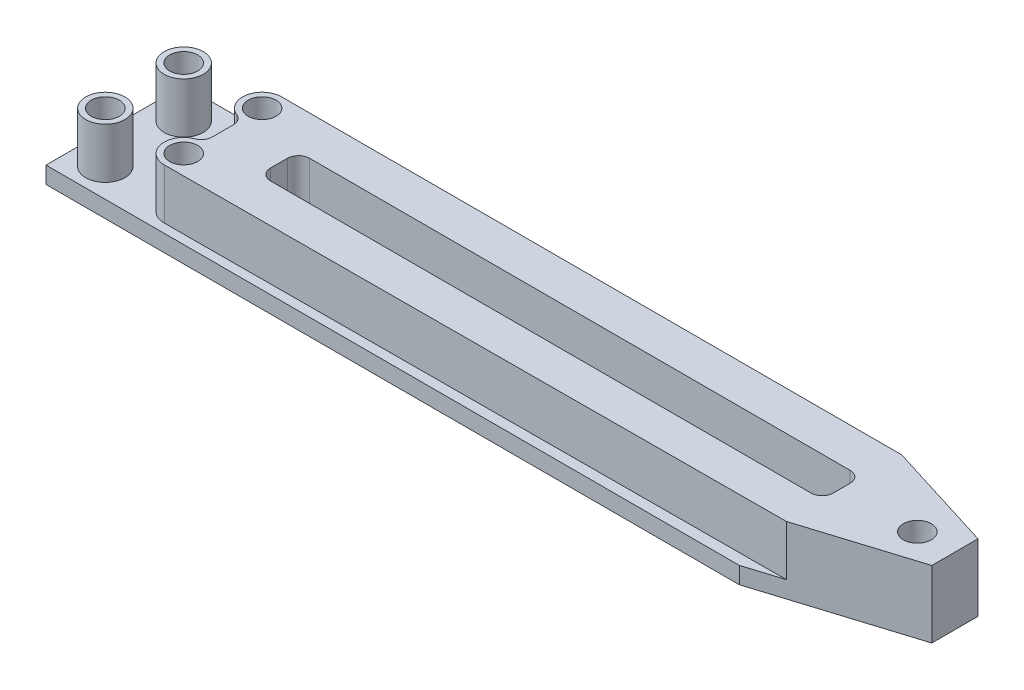
ISO-10303-21;
HEADER;
FILE_DESCRIPTION(('STEP AP214'),'2;1');
FILE_NAME('part.step','',(''),(''),'','','');
FILE_SCHEMA(('AUTOMOTIVE_DESIGN { 1 0 10303 214 1 1 1 1 }'));
ENDSEC;
DATA;
#1=APPLICATION_CONTEXT('core data for automotive mechanical design processes');
#2=APPLICATION_PROTOCOL_DEFINITION('international standard','automotive_design',2000,#1);
#3=PRODUCT_CONTEXT('',#1,'mechanical');
#4=PRODUCT('Part','Part','',(#3));
#5=PRODUCT_RELATED_PRODUCT_CATEGORY('part','',(#4));
#6=PRODUCT_DEFINITION_FORMATION('','',#4);
#7=PRODUCT_DEFINITION_CONTEXT('part definition',#1,'design');
#8=PRODUCT_DEFINITION('design','',#6,#7);
#9=PRODUCT_DEFINITION_SHAPE('','',#8);
#10=(LENGTH_UNIT() NAMED_UNIT(*) SI_UNIT(.MILLI.,.METRE.));
#11=(NAMED_UNIT(*) PLANE_ANGLE_UNIT() SI_UNIT($,.RADIAN.));
#12=(NAMED_UNIT(*) SI_UNIT($,.STERADIAN.) SOLID_ANGLE_UNIT());
#13=UNCERTAINTY_MEASURE_WITH_UNIT(LENGTH_MEASURE(1.E-05),#10,'distance_accuracy_value','');
#14=(GEOMETRIC_REPRESENTATION_CONTEXT(3) GLOBAL_UNCERTAINTY_ASSIGNED_CONTEXT((#13)) GLOBAL_UNIT_ASSIGNED_CONTEXT((#10,
#11,#12)) REPRESENTATION_CONTEXT('',''));
#15=CARTESIAN_POINT('',(0.,0.,0.));
#16=DIRECTION('',(0.,0.,1.));
#17=DIRECTION('',(1.,0.,0.));
#18=AXIS2_PLACEMENT_3D('',#15,#16,#17);
#19=CARTESIAN_POINT('',(0.,3.,0.));
#20=DIRECTION('',(0.,1.,0.));
#21=DIRECTION('',(0.,0.,1.));
#22=AXIS2_PLACEMENT_3D('',#19,#20,#21);
#23=PLANE('',#22);
#24=CARTESIAN_POINT('',(5.50000000000015,3.,-5.51588226593636));
#25=DIRECTION('',(0.,1.,0.));
#26=DIRECTION('',(0.,0.,1.));
#27=AXIS2_PLACEMENT_3D('',#24,#25,#26);
#28=CIRCLE('',#27,3.5);
#29=CARTESIAN_POINT('',(5.50000000000015,3.,-2.01588226593636));
#30=VERTEX_POINT('',#29);
#31=EDGE_CURVE('E221',#30,#30,#28,.T.);
#32=ORIENTED_EDGE('',*,*,#31,.F.);
#33=EDGE_LOOP('',(#32));
#34=FACE_BOUND('',#33,.T.);
#35=CARTESIAN_POINT('',(5.5,3.,-19.5158822659364));
#36=DIRECTION('',(0.,1.,0.));
#37=DIRECTION('',(0.,0.,1.));
#38=AXIS2_PLACEMENT_3D('',#35,#36,#37);
#39=CIRCLE('',#38,3.5);
#40=CARTESIAN_POINT('',(5.5,3.,-16.0158822659364));
#41=VERTEX_POINT('',#40);
#42=EDGE_CURVE('E247',#41,#41,#39,.T.);
#43=ORIENTED_EDGE('',*,*,#42,.F.);
#44=EDGE_LOOP('',(#43));
#45=FACE_BOUND('',#44,.T.);
#46=CARTESIAN_POINT('',(19.5000000000001,3.,-5.51588226593636));
#47=DIRECTION('',(0.,1.,0.));
#48=DIRECTION('',(0.,0.,1.));
#49=AXIS2_PLACEMENT_3D('',#46,#47,#48);
#50=CIRCLE('',#49,3.5);
#51=CARTESIAN_POINT('',(18.2272727272728,3.,-8.77627569146892));
#52=VERTEX_POINT('',#51);
#53=CARTESIAN_POINT('',(19.5259168115753,3.,-2.01597822169775));
#54=VERTEX_POINT('',#53);
#55=EDGE_CURVE('E203',#52,#54,#50,.T.);
#56=ORIENTED_EDGE('',*,*,#55,.F.);
#57=CARTESIAN_POINT('',(17.5,3.,-10.6393576489161));
#58=DIRECTION('',(0.,1.,0.));
#59=DIRECTION('',(0.,0.,1.));
#60=AXIS2_PLACEMENT_3D('',#57,#58,#59);
#61=CIRCLE('',#60,2.);
#62=CARTESIAN_POINT('',(19.5,3.,-10.6393576489161));
#63=VERTEX_POINT('',#62);
#64=EDGE_CURVE('E300',#52,#63,#61,.T.);
#65=ORIENTED_EDGE('',*,*,#64,.T.);
#66=DIRECTION('',(0.,0.,1.));
#67=VECTOR('',#66,1.);
#68=CARTESIAN_POINT('',(19.5,3.,0.));
#69=LINE('',#68,#67);
#70=CARTESIAN_POINT('',(19.5,3.,-14.3924068829566));
#71=VERTEX_POINT('',#70);
#72=EDGE_CURVE('E379',#71,#63,#69,.T.);
#73=ORIENTED_EDGE('',*,*,#72,.F.);
#74=CARTESIAN_POINT('',(17.5,3.,-14.3924068829566));
#75=DIRECTION('',(0.,1.,0.));
#76=DIRECTION('',(0.,0.,1.));
#77=AXIS2_PLACEMENT_3D('',#74,#75,#76);
#78=CIRCLE('',#77,2.);
#79=CARTESIAN_POINT('',(18.2272727272727,3.,-16.2554888404038));
#80=VERTEX_POINT('',#79);
#81=EDGE_CURVE('E298',#71,#80,#78,.T.);
#82=ORIENTED_EDGE('',*,*,#81,.T.);
#83=CARTESIAN_POINT('',(19.5,3.,-19.5158822659364));
#84=DIRECTION('',(0.,1.,0.));
#85=DIRECTION('',(0.,0.,1.));
#86=AXIS2_PLACEMENT_3D('',#83,#84,#85);
#87=CIRCLE('',#86,3.5);
#88=CARTESIAN_POINT('',(19.5,3.,-23.0158822659364));
#89=VERTEX_POINT('',#88);
#90=EDGE_CURVE('E239',#89,#80,#87,.T.);
#91=ORIENTED_EDGE('',*,*,#90,.F.);
#92=DIRECTION('',(1.,0.,0.));
#93=VECTOR('',#92,1.);
#94=CARTESIAN_POINT('',(0.,3.,-23.0158822659364));
#95=LINE('',#94,#93);
#96=CARTESIAN_POINT('',(130.218193952843,3.,-23.0158822659364));
#97=VERTEX_POINT('',#96);
#98=EDGE_CURVE('E389',#89,#97,#95,.T.);
#99=ORIENTED_EDGE('',*,*,#98,.T.);
#100=DIRECTION('',(0.954642144668202,0.,0.297755563547175));
#101=VECTOR('',#100,1.);
#102=CARTESIAN_POINT('',(18.0871983114519,3.,-57.9898544342325));
#103=LINE('',#102,#101);
#104=CARTESIAN_POINT('',(123.80594,3.,-25.0158822659364));
#105=VERTEX_POINT('',#104);
#106=EDGE_CURVE('E260',#105,#97,#103,.T.);
#107=ORIENTED_EDGE('',*,*,#106,.F.);
#108=DIRECTION('',(1.,0.,0.));
#109=VECTOR('',#108,1.);
#110=CARTESIAN_POINT('',(0.,3.,-25.0158822659364));
#111=LINE('',#110,#109);
#112=CARTESIAN_POINT('',(0.,3.,-25.0158822659364));
#113=VERTEX_POINT('',#112);
#114=EDGE_CURVE('E263',#113,#105,#111,.T.);
#115=ORIENTED_EDGE('',*,*,#114,.F.);
#116=DIRECTION('',(0.,0.,1.));
#117=VECTOR('',#116,1.);
#118=CARTESIAN_POINT('',(0.,3.,0.));
#119=LINE('',#118,#117);
#120=CARTESIAN_POINT('',(0.,3.,-0.425811109602711));
#121=VERTEX_POINT('',#120);
#122=EDGE_CURVE('E266',#113,#121,#119,.T.);
#123=ORIENTED_EDGE('',*,*,#122,.T.);
#124=DIRECTION('',(1.,0.,0.));
#125=VECTOR('',#124,1.);
#126=CARTESIAN_POINT('',(0.,3.,-0.425811109602711));
#127=LINE('',#126,#125);
#128=CARTESIAN_POINT('',(123.80594,3.,-0.425811109602711));
#129=VERTEX_POINT('',#128);
#130=EDGE_CURVE('E254',#121,#129,#127,.T.);
#131=ORIENTED_EDGE('',*,*,#130,.T.);
#132=DIRECTION('',(-0.954642144668202,0.,0.297755563547175));
#133=VECTOR('',#132,1.);
#134=CARTESIAN_POINT('',(10.8553967208498,3.,34.8037802664747));
#135=LINE('',#134,#133);
#136=CARTESIAN_POINT('',(130.218193952843,3.,-2.42581110960271));
#137=VERTEX_POINT('',#136);
#138=EDGE_CURVE('E257',#137,#129,#135,.T.);
#139=ORIENTED_EDGE('',*,*,#138,.F.);
#140=DIRECTION('',(-0.999993145993555,0.,0.00370242703006885));
#141=VECTOR('',#140,1.);
#142=CARTESIAN_POINT('',(-0.0071963004995829,3.,-1.94365780004558));
#143=LINE('',#142,#141);
#144=EDGE_CURVE('E403',#137,#54,#143,.T.);
#145=ORIENTED_EDGE('',*,*,#144,.T.);
#146=EDGE_LOOP('',(#56,#65,#73,#82,#91,#99,#107,#115,#123,#131,#139,#145));
#147=FACE_BOUND('',#146,.T.);
#148=ADVANCED_FACE('F38',(#34,#45,#147),#23,.T.);
#149=CARTESIAN_POINT('',(19.5,12.,-19.5158822659364));
#150=DIRECTION('',(0.,-1.,0.));
#151=DIRECTION('',(0.,0.,-1.));
#152=AXIS2_PLACEMENT_3D('',#149,#150,#151);
#153=CYLINDRICAL_SURFACE('',#152,3.5);
#154=ORIENTED_EDGE('',*,*,#90,.T.);
#155=DIRECTION('',(0.,-1.,0.));
#156=VECTOR('',#155,1.);
#157=CARTESIAN_POINT('',(18.2272727272727,12.,-16.2554888404038));
#158=LINE('',#157,#156);
#159=CARTESIAN_POINT('',(18.2272727272727,12.,-16.2554888404038));
#160=VERTEX_POINT('',#159);
#161=EDGE_CURVE('E307',#80,#160,#158,.F.);
#162=ORIENTED_EDGE('',*,*,#161,.T.);
#163=CARTESIAN_POINT('',(19.5,12.,-19.5158822659364));
#164=DIRECTION('',(0.,1.,0.));
#165=DIRECTION('',(0.,0.,1.));
#166=AXIS2_PLACEMENT_3D('',#163,#164,#165);
#167=CIRCLE('',#166,3.5);
#168=CARTESIAN_POINT('',(19.5,12.,-23.0158822659364));
#169=VERTEX_POINT('',#168);
#170=EDGE_CURVE('E240',#169,#160,#167,.T.);
#171=ORIENTED_EDGE('',*,*,#170,.F.);
#172=DIRECTION('',(0.,-1.,0.));
#173=VECTOR('',#172,1.);
#174=CARTESIAN_POINT('',(19.5,12.,-23.0158822659364));
#175=LINE('',#174,#173);
#176=EDGE_CURVE('E400',#169,#89,#175,.T.);
#177=ORIENTED_EDGE('',*,*,#176,.T.);
#178=EDGE_LOOP('',(#154,#162,#171,#177));
#179=FACE_BOUND('',#178,.T.);
#180=ADVANCED_FACE('F461',(#179),#153,.T.);
#181=CARTESIAN_POINT('',(19.5000000000001,12.,-5.51588226593636));
#182=DIRECTION('',(0.,-1.,0.));
#183=DIRECTION('',(0.,0.,-1.));
#184=AXIS2_PLACEMENT_3D('',#181,#182,#183);
#185=CYLINDRICAL_SURFACE('',#184,3.5);
#186=CARTESIAN_POINT('',(19.5000000000001,12.,-5.51588226593636));
#187=DIRECTION('',(0.,1.,0.));
#188=DIRECTION('',(0.,0.,1.));
#189=AXIS2_PLACEMENT_3D('',#186,#187,#188);
#190=CIRCLE('',#189,3.5);
#191=CARTESIAN_POINT('',(18.2272727272728,12.,-8.77627569146892));
#192=VERTEX_POINT('',#191);
#193=CARTESIAN_POINT('',(19.5259168115753,12.,-2.01597822169775));
#194=VERTEX_POINT('',#193);
#195=EDGE_CURVE('E188',#192,#194,#190,.T.);
#196=ORIENTED_EDGE('',*,*,#195,.F.);
#197=DIRECTION('',(0.,-1.,0.));
#198=VECTOR('',#197,1.);
#199=CARTESIAN_POINT('',(18.2272727272728,12.,-8.77627569146892));
#200=LINE('',#199,#198);
#201=EDGE_CURVE('E296',#192,#52,#200,.T.);
#202=ORIENTED_EDGE('',*,*,#201,.T.);
#203=ORIENTED_EDGE('',*,*,#55,.T.);
#204=DIRECTION('',(0.,-1.,0.));
#205=VECTOR('',#204,1.);
#206=CARTESIAN_POINT('',(19.5259168115753,12.,-2.01597822169775));
#207=LINE('',#206,#205);
#208=EDGE_CURVE('E209',#194,#54,#207,.T.);
#209=ORIENTED_EDGE('',*,*,#208,.F.);
#210=EDGE_LOOP('',(#196,#202,#203,#209));
#211=FACE_BOUND('',#210,.T.);
#212=ADVANCED_FACE('F216',(#211),#185,.T.);
#213=CARTESIAN_POINT('',(0.,3.,-0.425811109602711));
#214=DIRECTION('',(0.,0.,-1.));
#215=DIRECTION('',(-1.,0.,0.));
#216=AXIS2_PLACEMENT_3D('',#213,#214,#215);
#217=PLANE('',#216);
#218=DIRECTION('',(1.,0.,0.));
#219=VECTOR('',#218,1.);
#220=CARTESIAN_POINT('',(0.,0.,-0.425811109602711));
#221=LINE('',#220,#219);
#222=CARTESIAN_POINT('',(0.,0.,-0.425811109602711));
#223=VERTEX_POINT('',#222);
#224=CARTESIAN_POINT('',(123.80594,0.,-0.425811109602711));
#225=VERTEX_POINT('',#224);
#226=EDGE_CURVE('E251',#223,#225,#221,.T.);
#227=ORIENTED_EDGE('',*,*,#226,.T.);
#228=DIRECTION('',(0.,-1.,0.));
#229=VECTOR('',#228,1.);
#230=CARTESIAN_POINT('',(123.80594,3.,-0.425811109602711));
#231=LINE('',#230,#229);
#232=EDGE_CURVE('E294',#129,#225,#231,.T.);
#233=ORIENTED_EDGE('',*,*,#232,.F.);
#234=ORIENTED_EDGE('',*,*,#130,.F.);
#235=DIRECTION('',(0.,-1.,0.));
#236=VECTOR('',#235,1.);
#237=CARTESIAN_POINT('',(0.,3.,-0.425811109602711));
#238=LINE('',#237,#236);
#239=EDGE_CURVE('E268',#121,#223,#238,.T.);
#240=ORIENTED_EDGE('',*,*,#239,.T.);
#241=EDGE_LOOP('',(#227,#233,#234,#240));
#242=FACE_BOUND('',#241,.T.);
#243=ADVANCED_FACE('F433',(#242),#217,.F.);
#244=CARTESIAN_POINT('',(10.8553967208498,3.,34.8037802664747));
#245=DIRECTION('',(0.297755563547175,0.,0.954642144668202));
#246=DIRECTION('',(0.954642144668202,0.,-0.297755563547175));
#247=AXIS2_PLACEMENT_3D('',#244,#245,#246);
#248=PLANE('',#247);
#249=DIRECTION('',(-0.954642144668202,0.,0.297755563547175));
#250=VECTOR('',#249,1.);
#251=CARTESIAN_POINT('',(10.8553967208498,0.,34.8037802664747));
#252=LINE('',#251,#250);
#253=CARTESIAN_POINT('',(149.999997397364,0.,-8.59581110960271));
#254=VERTEX_POINT('',#253);
#255=EDGE_CURVE('E271',#254,#225,#252,.T.);
#256=ORIENTED_EDGE('',*,*,#255,.F.);
#257=DIRECTION('',(0.,-1.,0.));
#258=VECTOR('',#257,1.);
#259=CARTESIAN_POINT('',(149.999997397364,3.,-8.59581110960271));
#260=LINE('',#259,#258);
#261=CARTESIAN_POINT('',(149.999997397364,12.,-8.59581110960271));
#262=VERTEX_POINT('',#261);
#263=EDGE_CURVE('E292',#262,#254,#260,.T.);
#264=ORIENTED_EDGE('',*,*,#263,.F.);
#265=DIRECTION('',(0.954642144668202,0.,-0.297755563547175));
#266=VECTOR('',#265,1.);
#267=CARTESIAN_POINT('',(10.8553967208498,12.,34.8037802664747));
#268=LINE('',#267,#266);
#269=CARTESIAN_POINT('',(130.218193952843,12.,-2.42581110960271));
#270=VERTEX_POINT('',#269);
#271=EDGE_CURVE('E213',#270,#262,#268,.T.);
#272=ORIENTED_EDGE('',*,*,#271,.F.);
#273=DIRECTION('',(0.,-1.,0.));
#274=VECTOR('',#273,1.);
#275=CARTESIAN_POINT('',(130.218193952843,12.,-2.42581110960271));
#276=LINE('',#275,#274);
#277=EDGE_CURVE('E211',#270,#137,#276,.T.);
#278=ORIENTED_EDGE('',*,*,#277,.T.);
#279=ORIENTED_EDGE('',*,*,#138,.T.);
#280=ORIENTED_EDGE('',*,*,#232,.T.);
#281=EDGE_LOOP('',(#256,#264,#272,#278,#279,#280));
#282=FACE_BOUND('',#281,.T.);
#283=ADVANCED_FACE('F436',(#282),#248,.T.);
#284=CARTESIAN_POINT('',(149.999997397364,3.,0.));
#285=DIRECTION('',(1.,0.,0.));
#286=DIRECTION('',(0.,0.,-1.));
#287=AXIS2_PLACEMENT_3D('',#284,#285,#286);
#288=PLANE('',#287);
#289=DIRECTION('',(0.,0.,1.));
#290=VECTOR('',#289,1.);
#291=CARTESIAN_POINT('',(149.999997397364,0.,0.));
#292=LINE('',#291,#290);
#293=CARTESIAN_POINT('',(149.999997397364,0.,-16.8458822659364));
#294=VERTEX_POINT('',#293);
#295=EDGE_CURVE('E274',#294,#254,#292,.T.);
#296=ORIENTED_EDGE('',*,*,#295,.F.);
#297=DIRECTION('',(0.,-1.,0.));
#298=VECTOR('',#297,1.);
#299=CARTESIAN_POINT('',(149.999997397364,3.,-16.8458822659364));
#300=LINE('',#299,#298);
#301=CARTESIAN_POINT('',(149.999997397364,12.,-16.8458822659364));
#302=VERTEX_POINT('',#301);
#303=EDGE_CURVE('E290',#302,#294,#300,.T.);
#304=ORIENTED_EDGE('',*,*,#303,.F.);
#305=DIRECTION('',(0.,0.,-1.));
#306=VECTOR('',#305,1.);
#307=CARTESIAN_POINT('',(149.999997397364,12.,0.));
#308=LINE('',#307,#306);
#309=EDGE_CURVE('E392',#262,#302,#308,.T.);
#310=ORIENTED_EDGE('',*,*,#309,.F.);
#311=ORIENTED_EDGE('',*,*,#263,.T.);
#312=EDGE_LOOP('',(#296,#304,#310,#311));
#313=FACE_BOUND('',#312,.T.);
#314=ADVANCED_FACE('F485',(#313),#288,.T.);
#315=CARTESIAN_POINT('',(18.0871983114519,3.,-57.9898544342325));
#316=DIRECTION('',(0.297755563547175,0.,-0.954642144668202));
#317=DIRECTION('',(-0.954642144668202,0.,-0.297755563547175));
#318=AXIS2_PLACEMENT_3D('',#315,#316,#317);
#319=PLANE('',#318);
#320=DIRECTION('',(0.954642144668202,0.,0.297755563547175));
#321=VECTOR('',#320,1.);
#322=CARTESIAN_POINT('',(18.0871983114519,0.,-57.9898544342325));
#323=LINE('',#322,#321);
#324=CARTESIAN_POINT('',(123.80594,0.,-25.0158822659364));
#325=VERTEX_POINT('',#324);
#326=EDGE_CURVE('E277',#325,#294,#323,.T.);
#327=ORIENTED_EDGE('',*,*,#326,.F.);
#328=DIRECTION('',(0.,-1.,0.));
#329=VECTOR('',#328,1.);
#330=CARTESIAN_POINT('',(123.80594,3.,-25.0158822659364));
#331=LINE('',#330,#329);
#332=EDGE_CURVE('E288',#105,#325,#331,.T.);
#333=ORIENTED_EDGE('',*,*,#332,.F.);
#334=ORIENTED_EDGE('',*,*,#106,.T.);
#335=DIRECTION('',(0.,-1.,0.));
#336=VECTOR('',#335,1.);
#337=CARTESIAN_POINT('',(130.218193952843,12.,-23.0158822659364));
#338=LINE('',#337,#336);
#339=CARTESIAN_POINT('',(130.218193952843,12.,-23.0158822659364));
#340=VERTEX_POINT('',#339);
#341=EDGE_CURVE('E223',#340,#97,#338,.T.);
#342=ORIENTED_EDGE('',*,*,#341,.F.);
#343=DIRECTION('',(-0.954642144668202,0.,-0.297755563547175));
#344=VECTOR('',#343,1.);
#345=CARTESIAN_POINT('',(18.0871983114519,12.,-57.9898544342325));
#346=LINE('',#345,#344);
#347=EDGE_CURVE('E395',#302,#340,#346,.T.);
#348=ORIENTED_EDGE('',*,*,#347,.F.);
#349=ORIENTED_EDGE('',*,*,#303,.T.);
#350=EDGE_LOOP('',(#327,#333,#334,#342,#348,#349));
#351=FACE_BOUND('',#350,.T.);
#352=ADVANCED_FACE('F419',(#351),#319,.T.);
#353=CARTESIAN_POINT('',(0.,3.,-25.0158822659364));
#354=DIRECTION('',(0.,0.,-1.));
#355=DIRECTION('',(-1.,0.,0.));
#356=AXIS2_PLACEMENT_3D('',#353,#354,#355);
#357=PLANE('',#356);
#358=DIRECTION('',(1.,0.,0.));
#359=VECTOR('',#358,1.);
#360=CARTESIAN_POINT('',(0.,0.,-25.0158822659364));
#361=LINE('',#360,#359);
#362=CARTESIAN_POINT('',(0.,0.,-25.0158822659364));
#363=VERTEX_POINT('',#362);
#364=EDGE_CURVE('E280',#363,#325,#361,.T.);
#365=ORIENTED_EDGE('',*,*,#364,.F.);
#366=DIRECTION('',(0.,-1.,0.));
#367=VECTOR('',#366,1.);
#368=CARTESIAN_POINT('',(0.,3.,-25.0158822659364));
#369=LINE('',#368,#367);
#370=EDGE_CURVE('E286',#113,#363,#369,.T.);
#371=ORIENTED_EDGE('',*,*,#370,.F.);
#372=ORIENTED_EDGE('',*,*,#114,.T.);
#373=ORIENTED_EDGE('',*,*,#332,.T.);
#374=EDGE_LOOP('',(#365,#371,#372,#373));
#375=FACE_BOUND('',#374,.T.);
#376=ADVANCED_FACE('F422',(#375),#357,.T.);
#377=CARTESIAN_POINT('',(0.,3.,0.));
#378=DIRECTION('',(1.,0.,0.));
#379=DIRECTION('',(0.,0.,-1.));
#380=AXIS2_PLACEMENT_3D('',#377,#378,#379);
#381=PLANE('',#380);
#382=DIRECTION('',(0.,0.,1.));
#383=VECTOR('',#382,1.);
#384=CARTESIAN_POINT('',(0.,0.,0.));
#385=LINE('',#384,#383);
#386=EDGE_CURVE('E258',#363,#223,#385,.T.);
#387=ORIENTED_EDGE('',*,*,#386,.T.);
#388=ORIENTED_EDGE('',*,*,#239,.F.);
#389=ORIENTED_EDGE('',*,*,#122,.F.);
#390=ORIENTED_EDGE('',*,*,#370,.T.);
#391=EDGE_LOOP('',(#387,#388,#389,#390));
#392=FACE_BOUND('',#391,.T.);
#393=ADVANCED_FACE('F429',(#392),#381,.F.);
#394=CARTESIAN_POINT('',(0.,0.,0.));
#395=DIRECTION('',(0.,1.,0.));
#396=DIRECTION('',(0.,0.,1.));
#397=AXIS2_PLACEMENT_3D('',#394,#395,#396);
#398=PLANE('',#397);
#399=CARTESIAN_POINT('',(5.5,0.,-19.5158822659364));
#400=DIRECTION('',(0.,1.,0.));
#401=DIRECTION('',(0.,0.,1.));
#402=AXIS2_PLACEMENT_3D('',#399,#400,#401);
#403=CIRCLE('',#402,2.5);
#404=CARTESIAN_POINT('',(5.5,0.,-17.0158822659364));
#405=VERTEX_POINT('',#404);
#406=EDGE_CURVE('E42',#405,#405,#403,.T.);
#407=ORIENTED_EDGE('',*,*,#406,.T.);
#408=EDGE_LOOP('',(#407));
#409=FACE_BOUND('',#408,.T.);
#410=CARTESIAN_POINT('',(19.5,0.,-19.5158822659364));
#411=DIRECTION('',(0.,1.,0.));
#412=DIRECTION('',(0.,0.,1.));
#413=AXIS2_PLACEMENT_3D('',#410,#411,#412);
#414=CIRCLE('',#413,2.5);
#415=CARTESIAN_POINT('',(19.5,0.,-17.0158822659364));
#416=VERTEX_POINT('',#415);
#417=EDGE_CURVE('E349',#416,#416,#414,.T.);
#418=ORIENTED_EDGE('',*,*,#417,.T.);
#419=EDGE_LOOP('',(#418));
#420=FACE_BOUND('',#419,.T.);
#421=CARTESIAN_POINT('',(19.5000000000001,0.,-5.51588226593636));
#422=DIRECTION('',(0.,1.,0.));
#423=DIRECTION('',(0.,0.,1.));
#424=AXIS2_PLACEMENT_3D('',#421,#422,#423);
#425=CIRCLE('',#424,2.5);
#426=CARTESIAN_POINT('',(19.5000000000001,0.,-3.01588226593636));
#427=VERTEX_POINT('',#426);
#428=EDGE_CURVE('E347',#427,#427,#425,.T.);
#429=ORIENTED_EDGE('',*,*,#428,.T.);
#430=EDGE_LOOP('',(#429));
#431=FACE_BOUND('',#430,.T.);
#432=CARTESIAN_POINT('',(5.50000000000015,0.,-5.51588226593636));
#433=DIRECTION('',(0.,1.,0.));
#434=DIRECTION('',(0.,0.,1.));
#435=AXIS2_PLACEMENT_3D('',#432,#433,#434);
#436=CIRCLE('',#435,2.5);
#437=CARTESIAN_POINT('',(5.50000000000015,0.,-3.01588226593636));
#438=VERTEX_POINT('',#437);
#439=EDGE_CURVE('E344',#438,#438,#436,.T.);
#440=ORIENTED_EDGE('',*,*,#439,.T.);
#441=EDGE_LOOP('',(#440));
#442=FACE_BOUND('',#441,.T.);
#443=CARTESIAN_POINT('',(143.499997397364,0.,-12.5158822659364));
#444=DIRECTION('',(0.,-1.,0.));
#445=DIRECTION('',(0.,0.,-1.));
#446=AXIS2_PLACEMENT_3D('',#443,#444,#445);
#447=CIRCLE('',#446,2.5);
#448=CARTESIAN_POINT('',(143.499997397364,0.,-15.0158822659364));
#449=VERTEX_POINT('',#448);
#450=EDGE_CURVE('E354',#449,#449,#447,.T.);
#451=ORIENTED_EDGE('',*,*,#450,.F.);
#452=EDGE_LOOP('',(#451));
#453=FACE_BOUND('',#452,.T.);
#454=ORIENTED_EDGE('',*,*,#226,.F.);
#455=ORIENTED_EDGE('',*,*,#386,.F.);
#456=ORIENTED_EDGE('',*,*,#364,.T.);
#457=ORIENTED_EDGE('',*,*,#326,.T.);
#458=ORIENTED_EDGE('',*,*,#295,.T.);
#459=ORIENTED_EDGE('',*,*,#255,.T.);
#460=EDGE_LOOP('',(#454,#455,#456,#457,#458,#459));
#461=FACE_BOUND('',#460,.T.);
#462=ADVANCED_FACE('F475',(#409,#420,#431,#442,#453,#461),#398,.F.);
#463=CARTESIAN_POINT('',(5.5,12.,-19.5158822659364));
#464=DIRECTION('',(0.,1.,0.));
#465=DIRECTION('',(0.,0.,1.));
#466=AXIS2_PLACEMENT_3D('',#463,#464,#465);
#467=PLANE('',#466);
#468=CARTESIAN_POINT('',(5.5,12.,-19.5158822659364));
#469=DIRECTION('',(0.,1.,0.));
#470=DIRECTION('',(0.,0.,1.));
#471=AXIS2_PLACEMENT_3D('',#468,#469,#470);
#472=CIRCLE('',#471,3.5);
#473=CARTESIAN_POINT('',(5.5,12.,-16.0158822659364));
#474=VERTEX_POINT('',#473);
#475=EDGE_CURVE('E248',#474,#474,#472,.T.);
#476=ORIENTED_EDGE('',*,*,#475,.T.);
#477=EDGE_LOOP('',(#476));
#478=FACE_BOUND('',#477,.T.);
#479=CARTESIAN_POINT('',(5.5,12.,-19.5158822659364));
#480=DIRECTION('',(0.,1.,0.));
#481=DIRECTION('',(0.,0.,1.));
#482=AXIS2_PLACEMENT_3D('',#479,#480,#481);
#483=CIRCLE('',#482,2.5);
#484=CARTESIAN_POINT('',(5.5,12.,-17.0158822659364));
#485=VERTEX_POINT('',#484);
#486=EDGE_CURVE('E242',#485,#485,#483,.T.);
#487=ORIENTED_EDGE('',*,*,#486,.F.);
#488=EDGE_LOOP('',(#487));
#489=FACE_BOUND('',#488,.T.);
#490=ADVANCED_FACE('F478',(#478,#489),#467,.T.);
#491=CARTESIAN_POINT('',(5.5,12.,-19.5158822659364));
#492=DIRECTION('',(0.,-1.,0.));
#493=DIRECTION('',(0.,0.,-1.));
#494=AXIS2_PLACEMENT_3D('',#491,#492,#493);
#495=CYLINDRICAL_SURFACE('',#494,3.5);
#496=ORIENTED_EDGE('',*,*,#475,.F.);
#497=EDGE_LOOP('',(#496));
#498=FACE_BOUND('',#497,.T.);
#499=ORIENTED_EDGE('',*,*,#42,.T.);
#500=EDGE_LOOP('',(#499));
#501=FACE_BOUND('',#500,.T.);
#502=ADVANCED_FACE('F473',(#498,#501),#495,.T.);
#503=CARTESIAN_POINT('',(5.5,12.,-19.5158822659364));
#504=DIRECTION('',(0.,-1.,0.));
#505=DIRECTION('',(0.,0.,-1.));
#506=AXIS2_PLACEMENT_3D('',#503,#504,#505);
#507=CYLINDRICAL_SURFACE('',#506,2.5);
#508=ORIENTED_EDGE('',*,*,#486,.T.);
#509=EDGE_LOOP('',(#508));
#510=FACE_BOUND('',#509,.T.);
#511=ORIENTED_EDGE('',*,*,#406,.F.);
#512=EDGE_LOOP('',(#511));
#513=FACE_BOUND('',#512,.T.);
#514=ADVANCED_FACE('F506',(#510,#513),#507,.F.);
#515=CARTESIAN_POINT('',(19.5,12.,-19.5158822659364));
#516=DIRECTION('',(0.,1.,0.));
#517=DIRECTION('',(0.,0.,1.));
#518=AXIS2_PLACEMENT_3D('',#515,#516,#517);
#519=PLANE('',#518);
#520=CARTESIAN_POINT('',(143.499997397364,12.,-12.5158822659364));
#521=DIRECTION('',(0.,-1.,0.));
#522=DIRECTION('',(0.,0.,-1.));
#523=AXIS2_PLACEMENT_3D('',#520,#521,#522);
#524=CIRCLE('',#523,2.5);
#525=CARTESIAN_POINT('',(143.499997397364,12.,-15.0158822659364));
#526=VERTEX_POINT('',#525);
#527=EDGE_CURVE('E358',#526,#526,#524,.T.);
#528=ORIENTED_EDGE('',*,*,#527,.T.);
#529=EDGE_LOOP('',(#528));
#530=FACE_BOUND('',#529,.T.);
#531=DIRECTION('',(0.,0.,1.));
#532=VECTOR('',#531,1.);
#533=CARTESIAN_POINT('',(29.5,12.,-16.0158822659364));
#534=LINE('',#533,#532);
#535=CARTESIAN_POINT('',(29.5,12.,-14.0158822659364));
#536=VERTEX_POINT('',#535);
#537=CARTESIAN_POINT('',(29.5,12.,-11.0158822659364));
#538=VERTEX_POINT('',#537);
#539=EDGE_CURVE('E363',#536,#538,#534,.T.);
#540=ORIENTED_EDGE('',*,*,#539,.F.);
#541=CARTESIAN_POINT('',(31.5,12.,-14.0158822659364));
#542=DIRECTION('',(0.,1.,0.));
#543=DIRECTION('',(0.,0.,1.));
#544=AXIS2_PLACEMENT_3D('',#541,#542,#543);
#545=CIRCLE('',#544,2.);
#546=CARTESIAN_POINT('',(31.5,12.,-16.0158822659364));
#547=VERTEX_POINT('',#546);
#548=EDGE_CURVE('E11',#536,#547,#545,.F.);
#549=ORIENTED_EDGE('',*,*,#548,.T.);
#550=DIRECTION('',(-1.,0.,0.));
#551=VECTOR('',#550,1.);
#552=CARTESIAN_POINT('',(29.5,12.,-16.0158822659364));
#553=LINE('',#552,#551);
#554=CARTESIAN_POINT('',(127.999997397364,12.,-16.0158822659364));
#555=VERTEX_POINT('',#554);
#556=EDGE_CURVE('E370',#555,#547,#553,.T.);
#557=ORIENTED_EDGE('',*,*,#556,.F.);
#558=CARTESIAN_POINT('',(127.999997397364,12.,-14.0158822659364));
#559=DIRECTION('',(0.,1.,0.));
#560=DIRECTION('',(0.,0.,1.));
#561=AXIS2_PLACEMENT_3D('',#558,#559,#560);
#562=CIRCLE('',#561,2.);
#563=CARTESIAN_POINT('',(129.999997397364,12.,-14.0158822659364));
#564=VERTEX_POINT('',#563);
#565=EDGE_CURVE('E47',#555,#564,#562,.F.);
#566=ORIENTED_EDGE('',*,*,#565,.T.);
#567=DIRECTION('',(0.,0.,-1.));
#568=VECTOR('',#567,1.);
#569=CARTESIAN_POINT('',(129.999997397364,12.,-16.0158822659364));
#570=LINE('',#569,#568);
#571=CARTESIAN_POINT('',(129.999997397364,12.,-11.0158822659364));
#572=VERTEX_POINT('',#571);
#573=EDGE_CURVE('E385',#572,#564,#570,.T.);
#574=ORIENTED_EDGE('',*,*,#573,.F.);
#575=CARTESIAN_POINT('',(127.999997397364,12.,-11.0158822659364));
#576=DIRECTION('',(0.,1.,0.));
#577=DIRECTION('',(0.,0.,1.));
#578=AXIS2_PLACEMENT_3D('',#575,#576,#577);
#579=CIRCLE('',#578,2.);
#580=CARTESIAN_POINT('',(127.999997397364,12.,-9.01588226593636));
#581=VERTEX_POINT('',#580);
#582=EDGE_CURVE('E339',#572,#581,#579,.F.);
#583=ORIENTED_EDGE('',*,*,#582,.T.);
#584=DIRECTION('',(1.,0.,0.));
#585=VECTOR('',#584,1.);
#586=CARTESIAN_POINT('',(29.5,12.,-9.01588226593636));
#587=LINE('',#586,#585);
#588=CARTESIAN_POINT('',(31.5,12.,-9.01588226593636));
#589=VERTEX_POINT('',#588);
#590=EDGE_CURVE('E382',#589,#581,#587,.T.);
#591=ORIENTED_EDGE('',*,*,#590,.F.);
#592=CARTESIAN_POINT('',(31.5,12.,-11.0158822659364));
#593=DIRECTION('',(0.,1.,0.));
#594=DIRECTION('',(0.,0.,1.));
#595=AXIS2_PLACEMENT_3D('',#592,#593,#594);
#596=CIRCLE('',#595,2.);
#597=EDGE_CURVE('E341',#589,#538,#596,.F.);
#598=ORIENTED_EDGE('',*,*,#597,.T.);
#599=EDGE_LOOP('',(#540,#549,#557,#566,#574,#583,#591,#598));
#600=FACE_BOUND('',#599,.T.);
#601=ORIENTED_EDGE('',*,*,#170,.T.);
#602=CARTESIAN_POINT('',(17.5,12.,-14.3924068829566));
#603=DIRECTION('',(0.,1.,0.));
#604=DIRECTION('',(0.,0.,1.));
#605=AXIS2_PLACEMENT_3D('',#602,#603,#604);
#606=CIRCLE('',#605,2.);
#607=CARTESIAN_POINT('',(19.5,12.,-14.3924068829566));
#608=VERTEX_POINT('',#607);
#609=EDGE_CURVE('E337',#160,#608,#606,.F.);
#610=ORIENTED_EDGE('',*,*,#609,.T.);
#611=DIRECTION('',(0.,0.,1.));
#612=VECTOR('',#611,1.);
#613=CARTESIAN_POINT('',(19.5,12.,0.));
#614=LINE('',#613,#612);
#615=CARTESIAN_POINT('',(19.5,12.,-10.6393576489161));
#616=VERTEX_POINT('',#615);
#617=EDGE_CURVE('E214',#608,#616,#614,.T.);
#618=ORIENTED_EDGE('',*,*,#617,.T.);
#619=CARTESIAN_POINT('',(17.5,12.,-10.6393576489161));
#620=DIRECTION('',(0.,1.,0.));
#621=DIRECTION('',(0.,0.,1.));
#622=AXIS2_PLACEMENT_3D('',#619,#620,#621);
#623=CIRCLE('',#622,2.);
#624=EDGE_CURVE('E197',#616,#192,#623,.F.);
#625=ORIENTED_EDGE('',*,*,#624,.T.);
#626=ORIENTED_EDGE('',*,*,#195,.T.);
#627=DIRECTION('',(-0.999993145993555,0.,0.00370242703006885));
#628=VECTOR('',#627,1.);
#629=CARTESIAN_POINT('',(-0.0071963004995829,12.,-1.94365780004558));
#630=LINE('',#629,#628);
#631=EDGE_CURVE('E194',#270,#194,#630,.T.);
#632=ORIENTED_EDGE('',*,*,#631,.F.);
#633=ORIENTED_EDGE('',*,*,#271,.T.);
#634=ORIENTED_EDGE('',*,*,#309,.T.);
#635=ORIENTED_EDGE('',*,*,#347,.T.);
#636=DIRECTION('',(1.,0.,0.));
#637=VECTOR('',#636,1.);
#638=CARTESIAN_POINT('',(0.,12.,-23.0158822659364));
#639=LINE('',#638,#637);
#640=EDGE_CURVE('E397',#169,#340,#639,.T.);
#641=ORIENTED_EDGE('',*,*,#640,.F.);
#642=EDGE_LOOP('',(#601,#610,#618,#625,#626,#632,#633,#634,#635,#641));
#643=FACE_BOUND('',#642,.T.);
#644=CARTESIAN_POINT('',(19.5,12.,-19.5158822659364));
#645=DIRECTION('',(0.,1.,0.));
#646=DIRECTION('',(0.,0.,1.));
#647=AXIS2_PLACEMENT_3D('',#644,#645,#646);
#648=CIRCLE('',#647,2.5);
#649=CARTESIAN_POINT('',(19.5,12.,-17.0158822659364));
#650=VERTEX_POINT('',#649);
#651=EDGE_CURVE('E202',#650,#650,#648,.T.);
#652=ORIENTED_EDGE('',*,*,#651,.F.);
#653=EDGE_LOOP('',(#652));
#654=FACE_BOUND('',#653,.T.);
#655=CARTESIAN_POINT('',(19.5000000000001,12.,-5.51588226593636));
#656=DIRECTION('',(0.,1.,0.));
#657=DIRECTION('',(0.,0.,1.));
#658=AXIS2_PLACEMENT_3D('',#655,#656,#657);
#659=CIRCLE('',#658,2.5);
#660=CARTESIAN_POINT('',(19.5000000000001,12.,-3.01588226593636));
#661=VERTEX_POINT('',#660);
#662=EDGE_CURVE('E230',#661,#661,#659,.T.);
#663=ORIENTED_EDGE('',*,*,#662,.F.);
#664=EDGE_LOOP('',(#663));
#665=FACE_BOUND('',#664,.T.);
#666=ADVANCED_FACE('F191',(#530,#600,#643,#654,#665),#519,.T.);
#667=CARTESIAN_POINT('',(19.5,12.,-19.5158822659364));
#668=DIRECTION('',(0.,-1.,0.));
#669=DIRECTION('',(0.,0.,-1.));
#670=AXIS2_PLACEMENT_3D('',#667,#668,#669);
#671=CYLINDRICAL_SURFACE('',#670,2.5);
#672=ORIENTED_EDGE('',*,*,#651,.T.);
#673=EDGE_LOOP('',(#672));
#674=FACE_BOUND('',#673,.T.);
#675=ORIENTED_EDGE('',*,*,#417,.F.);
#676=EDGE_LOOP('',(#675));
#677=FACE_BOUND('',#676,.T.);
#678=ADVANCED_FACE('F501',(#674,#677),#671,.F.);
#679=CARTESIAN_POINT('',(19.5000000000001,12.,-5.51588226593636));
#680=DIRECTION('',(0.,-1.,0.));
#681=DIRECTION('',(0.,0.,-1.));
#682=AXIS2_PLACEMENT_3D('',#679,#680,#681);
#683=CYLINDRICAL_SURFACE('',#682,2.5);
#684=ORIENTED_EDGE('',*,*,#662,.T.);
#685=EDGE_LOOP('',(#684));
#686=FACE_BOUND('',#685,.T.);
#687=ORIENTED_EDGE('',*,*,#428,.F.);
#688=EDGE_LOOP('',(#687));
#689=FACE_BOUND('',#688,.T.);
#690=ADVANCED_FACE('F499',(#686,#689),#683,.F.);
#691=CARTESIAN_POINT('',(5.50000000000015,12.,-5.51588226593636));
#692=DIRECTION('',(0.,1.,0.));
#693=DIRECTION('',(0.,0.,1.));
#694=AXIS2_PLACEMENT_3D('',#691,#692,#693);
#695=PLANE('',#694);
#696=CARTESIAN_POINT('',(5.50000000000015,12.,-5.51588226593636));
#697=DIRECTION('',(0.,1.,0.));
#698=DIRECTION('',(0.,0.,1.));
#699=AXIS2_PLACEMENT_3D('',#696,#697,#698);
#700=CIRCLE('',#699,3.5);
#701=CARTESIAN_POINT('',(5.50000000000015,12.,-2.01588226593636));
#702=VERTEX_POINT('',#701);
#703=EDGE_CURVE('E227',#702,#702,#700,.T.);
#704=ORIENTED_EDGE('',*,*,#703,.T.);
#705=EDGE_LOOP('',(#704));
#706=FACE_BOUND('',#705,.T.);
#707=CARTESIAN_POINT('',(5.50000000000015,12.,-5.51588226593636));
#708=DIRECTION('',(0.,1.,0.));
#709=DIRECTION('',(0.,0.,1.));
#710=AXIS2_PLACEMENT_3D('',#707,#708,#709);
#711=CIRCLE('',#710,2.5);
#712=CARTESIAN_POINT('',(5.50000000000015,12.,-3.01588226593636));
#713=VERTEX_POINT('',#712);
#714=EDGE_CURVE('E218',#713,#713,#711,.T.);
#715=ORIENTED_EDGE('',*,*,#714,.F.);
#716=EDGE_LOOP('',(#715));
#717=FACE_BOUND('',#716,.T.);
#718=ADVANCED_FACE('F547',(#706,#717),#695,.T.);
#719=CARTESIAN_POINT('',(5.50000000000015,12.,-5.51588226593636));
#720=DIRECTION('',(0.,-1.,0.));
#721=DIRECTION('',(0.,0.,-1.));
#722=AXIS2_PLACEMENT_3D('',#719,#720,#721);
#723=CYLINDRICAL_SURFACE('',#722,3.5);
#724=ORIENTED_EDGE('',*,*,#703,.F.);
#725=EDGE_LOOP('',(#724));
#726=FACE_BOUND('',#725,.T.);
#727=ORIENTED_EDGE('',*,*,#31,.T.);
#728=EDGE_LOOP('',(#727));
#729=FACE_BOUND('',#728,.T.);
#730=ADVANCED_FACE('F555',(#726,#729),#723,.T.);
#731=CARTESIAN_POINT('',(5.50000000000015,12.,-5.51588226593636));
#732=DIRECTION('',(0.,-1.,0.));
#733=DIRECTION('',(0.,0.,-1.));
#734=AXIS2_PLACEMENT_3D('',#731,#732,#733);
#735=CYLINDRICAL_SURFACE('',#734,2.5);
#736=ORIENTED_EDGE('',*,*,#714,.T.);
#737=EDGE_LOOP('',(#736));
#738=FACE_BOUND('',#737,.T.);
#739=ORIENTED_EDGE('',*,*,#439,.F.);
#740=EDGE_LOOP('',(#739));
#741=FACE_BOUND('',#740,.T.);
#742=ADVANCED_FACE('F564',(#738,#741),#735,.F.);
#743=CARTESIAN_POINT('',(19.5,12.,0.));
#744=DIRECTION('',(1.,0.,0.));
#745=DIRECTION('',(0.,0.,-1.));
#746=AXIS2_PLACEMENT_3D('',#743,#744,#745);
#747=PLANE('',#746);
#748=ORIENTED_EDGE('',*,*,#72,.T.);
#749=DIRECTION('',(0.,1.,0.));
#750=VECTOR('',#749,1.);
#751=CARTESIAN_POINT('',(19.5,12.,-10.6393576489161));
#752=LINE('',#751,#750);
#753=EDGE_CURVE('E305',#63,#616,#752,.T.);
#754=ORIENTED_EDGE('',*,*,#753,.T.);
#755=ORIENTED_EDGE('',*,*,#617,.F.);
#756=DIRECTION('',(0.,1.,0.));
#757=VECTOR('',#756,1.);
#758=CARTESIAN_POINT('',(19.5,3.,-14.3924068829566));
#759=LINE('',#758,#757);
#760=EDGE_CURVE('E302',#608,#71,#759,.F.);
#761=ORIENTED_EDGE('',*,*,#760,.T.);
#762=EDGE_LOOP('',(#748,#754,#755,#761));
#763=FACE_BOUND('',#762,.T.);
#764=ADVANCED_FACE('F441',(#763),#747,.F.);
#765=CARTESIAN_POINT('',(-0.0071963004995829,12.,-1.94365780004558));
#766=DIRECTION('',(0.00370242703006885,0.,0.999993145993555));
#767=DIRECTION('',(0.999993145993555,0.,-0.00370242703006885));
#768=AXIS2_PLACEMENT_3D('',#765,#766,#767);
#769=PLANE('',#768);
#770=ORIENTED_EDGE('',*,*,#144,.F.);
#771=ORIENTED_EDGE('',*,*,#277,.F.);
#772=ORIENTED_EDGE('',*,*,#631,.T.);
#773=ORIENTED_EDGE('',*,*,#208,.T.);
#774=EDGE_LOOP('',(#770,#771,#772,#773));
#775=FACE_BOUND('',#774,.T.);
#776=ADVANCED_FACE('F208',(#775),#769,.T.);
#777=CARTESIAN_POINT('',(0.,12.,-23.0158822659364));
#778=DIRECTION('',(0.,0.,-1.));
#779=DIRECTION('',(-1.,0.,0.));
#780=AXIS2_PLACEMENT_3D('',#777,#778,#779);
#781=PLANE('',#780);
#782=ORIENTED_EDGE('',*,*,#98,.F.);
#783=ORIENTED_EDGE('',*,*,#176,.F.);
#784=ORIENTED_EDGE('',*,*,#640,.T.);
#785=ORIENTED_EDGE('',*,*,#341,.T.);
#786=EDGE_LOOP('',(#782,#783,#784,#785));
#787=FACE_BOUND('',#786,.T.);
#788=ADVANCED_FACE('F410',(#787),#781,.T.);
#789=CARTESIAN_POINT('',(29.5,3.,-16.0158822659364));
#790=DIRECTION('',(-1.,0.,0.));
#791=DIRECTION('',(0.,0.,1.));
#792=AXIS2_PLACEMENT_3D('',#789,#790,#791);
#793=PLANE('',#792);
#794=ORIENTED_EDGE('',*,*,#539,.T.);
#795=DIRECTION('',(0.,1.,0.));
#796=VECTOR('',#795,1.);
#797=CARTESIAN_POINT('',(29.5,3.,-11.0158822659364));
#798=LINE('',#797,#796);
#799=CARTESIAN_POINT('',(29.5,3.,-11.0158822659364));
#800=VERTEX_POINT('',#799);
#801=EDGE_CURVE('E330',#538,#800,#798,.F.);
#802=ORIENTED_EDGE('',*,*,#801,.T.);
#803=DIRECTION('',(0.,0.,1.));
#804=VECTOR('',#803,1.);
#805=CARTESIAN_POINT('',(29.5,3.,-16.0158822659364));
#806=LINE('',#805,#804);
#807=CARTESIAN_POINT('',(29.5,3.,-14.0158822659364));
#808=VERTEX_POINT('',#807);
#809=EDGE_CURVE('E366',#808,#800,#806,.T.);
#810=ORIENTED_EDGE('',*,*,#809,.F.);
#811=DIRECTION('',(0.,1.,0.));
#812=VECTOR('',#811,1.);
#813=CARTESIAN_POINT('',(29.5,12.,-14.0158822659364));
#814=LINE('',#813,#812);
#815=EDGE_CURVE('E327',#808,#536,#814,.T.);
#816=ORIENTED_EDGE('',*,*,#815,.T.);
#817=EDGE_LOOP('',(#794,#802,#810,#816));
#818=FACE_BOUND('',#817,.T.);
#819=ADVANCED_FACE('F591',(#818),#793,.F.);
#820=CARTESIAN_POINT('',(29.5,3.,-16.0158822659364));
#821=DIRECTION('',(0.,0.,-1.));
#822=DIRECTION('',(-1.,0.,0.));
#823=AXIS2_PLACEMENT_3D('',#820,#821,#822);
#824=PLANE('',#823);
#825=DIRECTION('',(-1.,0.,0.));
#826=VECTOR('',#825,1.);
#827=CARTESIAN_POINT('',(29.5,3.,-16.0158822659364));
#828=LINE('',#827,#826);
#829=CARTESIAN_POINT('',(127.999997397364,3.,-16.0158822659364));
#830=VERTEX_POINT('',#829);
#831=CARTESIAN_POINT('',(31.5,3.,-16.0158822659364));
#832=VERTEX_POINT('',#831);
#833=EDGE_CURVE('E376',#830,#832,#828,.T.);
#834=ORIENTED_EDGE('',*,*,#833,.F.);
#835=DIRECTION('',(0.,1.,0.));
#836=VECTOR('',#835,1.);
#837=CARTESIAN_POINT('',(127.999997397364,12.,-16.0158822659364));
#838=LINE('',#837,#836);
#839=EDGE_CURVE('E334',#830,#555,#838,.T.);
#840=ORIENTED_EDGE('',*,*,#839,.T.);
#841=ORIENTED_EDGE('',*,*,#556,.T.);
#842=DIRECTION('',(0.,1.,0.));
#843=VECTOR('',#842,1.);
#844=CARTESIAN_POINT('',(31.5,3.,-16.0158822659364));
#845=LINE('',#844,#843);
#846=EDGE_CURVE('E332',#547,#832,#845,.F.);
#847=ORIENTED_EDGE('',*,*,#846,.T.);
#848=EDGE_LOOP('',(#834,#840,#841,#847));
#849=FACE_BOUND('',#848,.T.);
#850=ADVANCED_FACE('F597',(#849),#824,.F.);
#851=CARTESIAN_POINT('',(129.999997397364,3.,-16.0158822659364));
#852=DIRECTION('',(1.,0.,0.));
#853=DIRECTION('',(0.,0.,-1.));
#854=AXIS2_PLACEMENT_3D('',#851,#852,#853);
#855=PLANE('',#854);
#856=DIRECTION('',(0.,0.,-1.));
#857=VECTOR('',#856,1.);
#858=CARTESIAN_POINT('',(129.999997397364,3.,-16.0158822659364));
#859=LINE('',#858,#857);
#860=CARTESIAN_POINT('',(129.999997397364,3.,-11.0158822659364));
#861=VERTEX_POINT('',#860);
#862=CARTESIAN_POINT('',(129.999997397364,3.,-14.0158822659364));
#863=VERTEX_POINT('',#862);
#864=EDGE_CURVE('E373',#861,#863,#859,.T.);
#865=ORIENTED_EDGE('',*,*,#864,.F.);
#866=DIRECTION('',(0.,1.,0.));
#867=VECTOR('',#866,1.);
#868=CARTESIAN_POINT('',(129.999997397364,12.,-11.0158822659364));
#869=LINE('',#868,#867);
#870=EDGE_CURVE('E311',#861,#572,#869,.T.);
#871=ORIENTED_EDGE('',*,*,#870,.T.);
#872=ORIENTED_EDGE('',*,*,#573,.T.);
#873=DIRECTION('',(0.,1.,0.));
#874=VECTOR('',#873,1.);
#875=CARTESIAN_POINT('',(129.999997397364,3.,-14.0158822659364));
#876=LINE('',#875,#874);
#877=EDGE_CURVE('E309',#564,#863,#876,.F.);
#878=ORIENTED_EDGE('',*,*,#877,.T.);
#879=EDGE_LOOP('',(#865,#871,#872,#878));
#880=FACE_BOUND('',#879,.T.);
#881=ADVANCED_FACE('F605',(#880),#855,.F.);
#882=CARTESIAN_POINT('',(29.5,3.,-9.01588226593636));
#883=DIRECTION('',(0.,0.,1.));
#884=DIRECTION('',(1.,0.,0.));
#885=AXIS2_PLACEMENT_3D('',#882,#883,#884);
#886=PLANE('',#885);
#887=ORIENTED_EDGE('',*,*,#590,.T.);
#888=DIRECTION('',(0.,1.,0.));
#889=VECTOR('',#888,1.);
#890=CARTESIAN_POINT('',(127.999997397364,3.,-9.01588226593636));
#891=LINE('',#890,#889);
#892=CARTESIAN_POINT('',(127.999997397364,3.,-9.01588226593636));
#893=VERTEX_POINT('',#892);
#894=EDGE_CURVE('E317',#581,#893,#891,.F.);
#895=ORIENTED_EDGE('',*,*,#894,.T.);
#896=DIRECTION('',(1.,0.,0.));
#897=VECTOR('',#896,1.);
#898=CARTESIAN_POINT('',(29.5,3.,-9.01588226593636));
#899=LINE('',#898,#897);
#900=CARTESIAN_POINT('',(31.5,3.,-9.01588226593636));
#901=VERTEX_POINT('',#900);
#902=EDGE_CURVE('E369',#901,#893,#899,.T.);
#903=ORIENTED_EDGE('',*,*,#902,.F.);
#904=DIRECTION('',(0.,1.,0.));
#905=VECTOR('',#904,1.);
#906=CARTESIAN_POINT('',(31.5,12.,-9.01588226593636));
#907=LINE('',#906,#905);
#908=EDGE_CURVE('E314',#901,#589,#907,.T.);
#909=ORIENTED_EDGE('',*,*,#908,.T.);
#910=EDGE_LOOP('',(#887,#895,#903,#909));
#911=FACE_BOUND('',#910,.T.);
#912=ADVANCED_FACE('F613',(#911),#886,.F.);
#913=CARTESIAN_POINT('',(0.,3.,0.));
#914=DIRECTION('',(0.,1.,0.));
#915=DIRECTION('',(0.,0.,1.));
#916=AXIS2_PLACEMENT_3D('',#913,#914,#915);
#917=PLANE('',#916);
#918=ORIENTED_EDGE('',*,*,#902,.T.);
#919=CARTESIAN_POINT('',(127.999997397364,3.,-11.0158822659364));
#920=DIRECTION('',(0.,1.,0.));
#921=DIRECTION('',(0.,0.,1.));
#922=AXIS2_PLACEMENT_3D('',#919,#920,#921);
#923=CIRCLE('',#922,2.);
#924=EDGE_CURVE('E325',#893,#861,#923,.T.);
#925=ORIENTED_EDGE('',*,*,#924,.T.);
#926=ORIENTED_EDGE('',*,*,#864,.T.);
#927=CARTESIAN_POINT('',(127.999997397364,3.,-14.0158822659364));
#928=DIRECTION('',(0.,1.,0.));
#929=DIRECTION('',(0.,0.,1.));
#930=AXIS2_PLACEMENT_3D('',#927,#928,#929);
#931=CIRCLE('',#930,2.);
#932=EDGE_CURVE('E321',#863,#830,#931,.T.);
#933=ORIENTED_EDGE('',*,*,#932,.T.);
#934=ORIENTED_EDGE('',*,*,#833,.T.);
#935=CARTESIAN_POINT('',(31.5,3.,-14.0158822659364));
#936=DIRECTION('',(0.,1.,0.));
#937=DIRECTION('',(0.,0.,1.));
#938=AXIS2_PLACEMENT_3D('',#935,#936,#937);
#939=CIRCLE('',#938,2.);
#940=EDGE_CURVE('E319',#832,#808,#939,.T.);
#941=ORIENTED_EDGE('',*,*,#940,.T.);
#942=ORIENTED_EDGE('',*,*,#809,.T.);
#943=CARTESIAN_POINT('',(31.5,3.,-11.0158822659364));
#944=DIRECTION('',(0.,1.,0.));
#945=DIRECTION('',(0.,0.,1.));
#946=AXIS2_PLACEMENT_3D('',#943,#944,#945);
#947=CIRCLE('',#946,2.);
#948=EDGE_CURVE('E323',#800,#901,#947,.T.);
#949=ORIENTED_EDGE('',*,*,#948,.T.);
#950=EDGE_LOOP('',(#918,#925,#926,#933,#934,#941,#942,#949));
#951=FACE_BOUND('',#950,.T.);
#952=ADVANCED_FACE('F456',(#951),#917,.T.);
#953=CARTESIAN_POINT('',(143.499997397364,12.,-12.5158822659364));
#954=DIRECTION('',(0.,-1.,0.));
#955=DIRECTION('',(0.,0.,-1.));
#956=AXIS2_PLACEMENT_3D('',#953,#954,#955);
#957=CYLINDRICAL_SURFACE('',#956,2.5);
#958=ORIENTED_EDGE('',*,*,#527,.F.);
#959=EDGE_LOOP('',(#958));
#960=FACE_BOUND('',#959,.T.);
#961=ORIENTED_EDGE('',*,*,#450,.T.);
#962=EDGE_LOOP('',(#961));
#963=FACE_BOUND('',#962,.T.);
#964=ADVANCED_FACE('F447',(#960,#963),#957,.F.);
#965=CARTESIAN_POINT('',(17.5,12.,-10.6393576489161));
#966=DIRECTION('',(0.,-1.,0.));
#967=DIRECTION('',(0.,0.,-1.));
#968=AXIS2_PLACEMENT_3D('',#965,#966,#967);
#969=CYLINDRICAL_SURFACE('',#968,2.);
#970=ORIENTED_EDGE('',*,*,#624,.F.);
#971=ORIENTED_EDGE('',*,*,#753,.F.);
#972=ORIENTED_EDGE('',*,*,#64,.F.);
#973=ORIENTED_EDGE('',*,*,#201,.F.);
#974=EDGE_LOOP('',(#970,#971,#972,#973));
#975=FACE_BOUND('',#974,.T.);
#976=ADVANCED_FACE('F444',(#975),#969,.F.);
#977=CARTESIAN_POINT('',(17.5,12.,-14.3924068829566));
#978=DIRECTION('',(0.,-1.,0.));
#979=DIRECTION('',(0.,0.,-1.));
#980=AXIS2_PLACEMENT_3D('',#977,#978,#979);
#981=CYLINDRICAL_SURFACE('',#980,2.);
#982=ORIENTED_EDGE('',*,*,#609,.F.);
#983=ORIENTED_EDGE('',*,*,#161,.F.);
#984=ORIENTED_EDGE('',*,*,#81,.F.);
#985=ORIENTED_EDGE('',*,*,#760,.F.);
#986=EDGE_LOOP('',(#982,#983,#984,#985));
#987=FACE_BOUND('',#986,.T.);
#988=ADVANCED_FACE('F446',(#987),#981,.F.);
#989=CARTESIAN_POINT('',(127.999997397364,3.,-11.0158822659364));
#990=DIRECTION('',(0.,-1.,0.));
#991=DIRECTION('',(0.,0.,-1.));
#992=AXIS2_PLACEMENT_3D('',#989,#990,#991);
#993=CYLINDRICAL_SURFACE('',#992,2.);
#994=ORIENTED_EDGE('',*,*,#924,.F.);
#995=ORIENTED_EDGE('',*,*,#894,.F.);
#996=ORIENTED_EDGE('',*,*,#582,.F.);
#997=ORIENTED_EDGE('',*,*,#870,.F.);
#998=EDGE_LOOP('',(#994,#995,#996,#997));
#999=FACE_BOUND('',#998,.T.);
#1000=ADVANCED_FACE('F453',(#999),#993,.F.);
#1001=CARTESIAN_POINT('',(31.5,3.,-11.0158822659364));
#1002=DIRECTION('',(0.,-1.,0.));
#1003=DIRECTION('',(0.,0.,-1.));
#1004=AXIS2_PLACEMENT_3D('',#1001,#1002,#1003);
#1005=CYLINDRICAL_SURFACE('',#1004,2.);
#1006=ORIENTED_EDGE('',*,*,#948,.F.);
#1007=ORIENTED_EDGE('',*,*,#801,.F.);
#1008=ORIENTED_EDGE('',*,*,#597,.F.);
#1009=ORIENTED_EDGE('',*,*,#908,.F.);
#1010=EDGE_LOOP('',(#1006,#1007,#1008,#1009));
#1011=FACE_BOUND('',#1010,.T.);
#1012=ADVANCED_FACE('F807',(#1011),#1005,.F.);
#1013=CARTESIAN_POINT('',(127.999997397364,3.,-14.0158822659364));
#1014=DIRECTION('',(0.,-1.,0.));
#1015=DIRECTION('',(0.,0.,-1.));
#1016=AXIS2_PLACEMENT_3D('',#1013,#1014,#1015);
#1017=CYLINDRICAL_SURFACE('',#1016,2.);
#1018=ORIENTED_EDGE('',*,*,#932,.F.);
#1019=ORIENTED_EDGE('',*,*,#877,.F.);
#1020=ORIENTED_EDGE('',*,*,#565,.F.);
#1021=ORIENTED_EDGE('',*,*,#839,.F.);
#1022=EDGE_LOOP('',(#1018,#1019,#1020,#1021));
#1023=FACE_BOUND('',#1022,.T.);
#1024=ADVANCED_FACE('F797',(#1023),#1017,.F.);
#1025=CARTESIAN_POINT('',(31.5,3.,-14.0158822659364));
#1026=DIRECTION('',(0.,-1.,0.));
#1027=DIRECTION('',(0.,0.,-1.));
#1028=AXIS2_PLACEMENT_3D('',#1025,#1026,#1027);
#1029=CYLINDRICAL_SURFACE('',#1028,2.);
#1030=ORIENTED_EDGE('',*,*,#940,.F.);
#1031=ORIENTED_EDGE('',*,*,#846,.F.);
#1032=ORIENTED_EDGE('',*,*,#548,.F.);
#1033=ORIENTED_EDGE('',*,*,#815,.F.);
#1034=EDGE_LOOP('',(#1030,#1031,#1032,#1033));
#1035=FACE_BOUND('',#1034,.T.);
#1036=ADVANCED_FACE('F40',(#1035),#1029,.F.);
#1037=CLOSED_SHELL('',(#148,#180,#212,#243,#283,#314,#352,#376,#393,#462,#490,#502,#514,#666,
#678,#690,#718,#730,#742,#764,#776,#788,#819,#850,#881,#912,#952,#964,#976,#988,#1000,#1012,
#1024,#1036));
#1038=MANIFOLD_SOLID_BREP('B2',#1037);
#1039=ADVANCED_BREP_SHAPE_REPRESENTATION('',(#18,#1038),#14);
#1040=SHAPE_DEFINITION_REPRESENTATION(#9,#1039);
ENDSEC;
END-ISO-10303-21;
